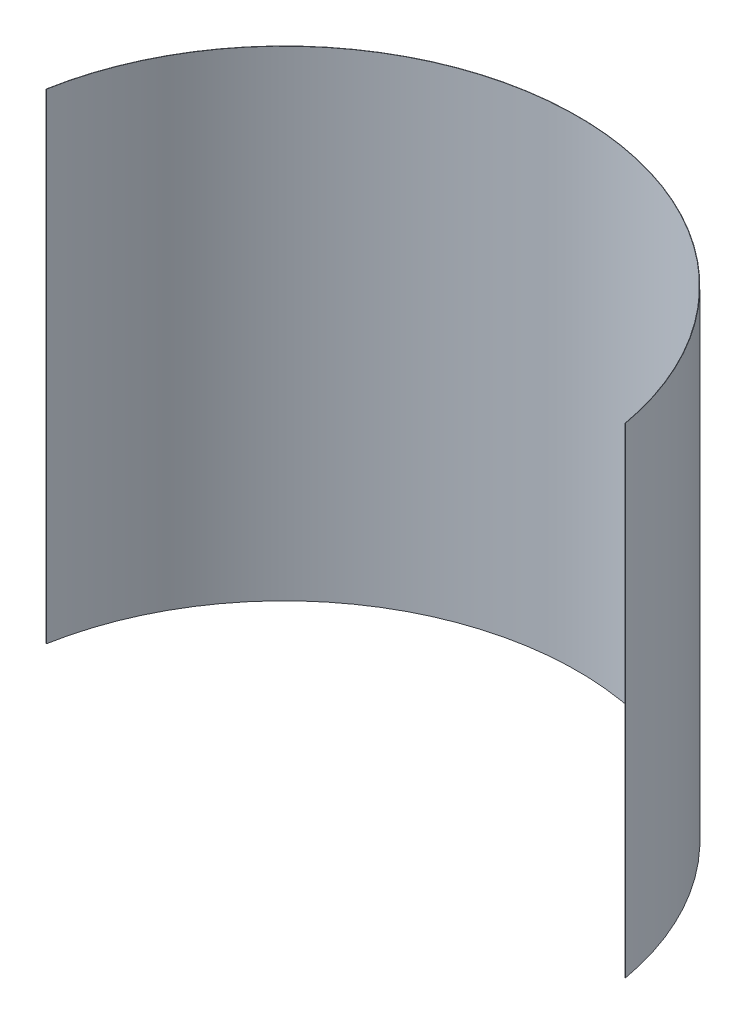
ISO-10303-21;
HEADER;
FILE_DESCRIPTION(('STEP AP214'),'2;1');
FILE_NAME('part.step','',(''),(''),'','','');
FILE_SCHEMA(('AUTOMOTIVE_DESIGN { 1 0 10303 214 1 1 1 1 }'));
ENDSEC;
DATA;
#1=APPLICATION_CONTEXT('core data for automotive mechanical design processes');
#2=APPLICATION_PROTOCOL_DEFINITION('international standard','automotive_design',2000,#1);
#3=PRODUCT_CONTEXT('',#1,'mechanical');
#4=PRODUCT('Part','Part','',(#3));
#5=PRODUCT_RELATED_PRODUCT_CATEGORY('part','',(#4));
#6=PRODUCT_DEFINITION_FORMATION('','',#4);
#7=PRODUCT_DEFINITION_CONTEXT('part definition',#1,'design');
#8=PRODUCT_DEFINITION('design','',#6,#7);
#9=PRODUCT_DEFINITION_SHAPE('','',#8);
#10=(LENGTH_UNIT() NAMED_UNIT(*) SI_UNIT(.MILLI.,.METRE.));
#11=(NAMED_UNIT(*) PLANE_ANGLE_UNIT() SI_UNIT($,.RADIAN.));
#12=(NAMED_UNIT(*) SI_UNIT($,.STERADIAN.) SOLID_ANGLE_UNIT());
#13=UNCERTAINTY_MEASURE_WITH_UNIT(LENGTH_MEASURE(1.E-05),#10,'distance_accuracy_value','');
#14=(GEOMETRIC_REPRESENTATION_CONTEXT(3) GLOBAL_UNCERTAINTY_ASSIGNED_CONTEXT((#13)) GLOBAL_UNIT_ASSIGNED_CONTEXT((#10,
#11,#12)) REPRESENTATION_CONTEXT('',''));
#15=CARTESIAN_POINT('',(0.,0.,0.));
#16=DIRECTION('',(0.,0.,1.));
#17=DIRECTION('',(1.,0.,0.));
#18=AXIS2_PLACEMENT_3D('',#15,#16,#17);
#19=CARTESIAN_POINT('',(1067.6,0.,0.));
#20=DIRECTION('',(0.,1.,0.));
#21=DIRECTION('',(0.,0.,1.));
#22=AXIS2_PLACEMENT_3D('',#19,#20,#21);
#23=PLANE('',#22);
#24=DIRECTION('',(-0.984272308752148,0.,-0.176657924316223));
#25=VECTOR('',#24,1.);
#26=CARTESIAN_POINT('',(16.7908831762067,0.,-188.6));
#27=LINE('',#26,#25);
#28=CARTESIAN_POINT('',(17.7751554849588,0.,-188.423342075684));
#29=VERTEX_POINT('',#28);
#30=CARTESIAN_POINT('',(16.7908831762067,0.,-188.6));
#31=VERTEX_POINT('',#30);
#32=EDGE_CURVE('E11',#29,#31,#27,.T.);
#33=ORIENTED_EDGE('',*,*,#32,.F.);
#34=CARTESIAN_POINT('',(1067.6,0.,0.));
#35=DIRECTION('',(0.,-1.,0.));
#36=DIRECTION('',(0.,0.,-1.));
#37=AXIS2_PLACEMENT_3D('',#34,#35,#36);
#38=CIRCLE('',#37,1066.6);
#39=CARTESIAN_POINT('',(2117.42484451504,0.,-188.423342075684));
#40=VERTEX_POINT('',#39);
#41=EDGE_CURVE('E76',#29,#40,#38,.T.);
#42=ORIENTED_EDGE('',*,*,#41,.T.);
#43=DIRECTION('',(0.984272308752148,0.,-0.176657924316223));
#44=VECTOR('',#43,1.);
#45=CARTESIAN_POINT('',(2118.40911682379,0.,-188.6));
#46=LINE('',#45,#44);
#47=CARTESIAN_POINT('',(2118.40911682379,0.,-188.6));
#48=VERTEX_POINT('',#47);
#49=EDGE_CURVE('E52',#40,#48,#46,.T.);
#50=ORIENTED_EDGE('',*,*,#49,.T.);
#51=CARTESIAN_POINT('',(1067.6,0.,0.));
#52=DIRECTION('',(0.,-1.,0.));
#53=DIRECTION('',(0.,0.,-1.));
#54=AXIS2_PLACEMENT_3D('',#51,#52,#53);
#55=CIRCLE('',#54,1067.6);
#56=EDGE_CURVE('E78',#31,#48,#55,.T.);
#57=ORIENTED_EDGE('',*,*,#56,.F.);
#58=EDGE_LOOP('',(#33,#42,#50,#57));
#59=FACE_BOUND('',#58,.T.);
#60=ADVANCED_FACE('F41',(#59),#23,.T.);
#61=CARTESIAN_POINT('',(2118.40911682379,-871.5,-188.6));
#62=DIRECTION('',(0.176657924316223,0.,0.984272308752148));
#63=DIRECTION('',(0.,-1.,0.));
#64=AXIS2_PLACEMENT_3D('',#61,#62,#63);
#65=PLANE('',#64);
#66=ORIENTED_EDGE('',*,*,#49,.F.);
#67=DIRECTION('',(0.,-1.,0.));
#68=VECTOR('',#67,1.);
#69=CARTESIAN_POINT('',(2117.42484451504,0.,-188.423342075684));
#70=LINE('',#69,#68);
#71=CARTESIAN_POINT('',(2117.42484451504,-1743.,-188.423342075684));
#72=VERTEX_POINT('',#71);
#73=EDGE_CURVE('E90',#40,#72,#70,.T.);
#74=ORIENTED_EDGE('',*,*,#73,.T.);
#75=DIRECTION('',(0.984272308752148,0.,-0.176657924316223));
#76=VECTOR('',#75,1.);
#77=CARTESIAN_POINT('',(2118.40911682379,-1743.,-188.6));
#78=LINE('',#77,#76);
#79=CARTESIAN_POINT('',(2118.40911682379,-1743.,-188.6));
#80=VERTEX_POINT('',#79);
#81=EDGE_CURVE('E101',#72,#80,#78,.T.);
#82=ORIENTED_EDGE('',*,*,#81,.T.);
#83=DIRECTION('',(0.,-1.,0.));
#84=VECTOR('',#83,1.);
#85=CARTESIAN_POINT('',(2118.40911682379,0.,-188.6));
#86=LINE('',#85,#84);
#87=EDGE_CURVE('E107',#48,#80,#86,.T.);
#88=ORIENTED_EDGE('',*,*,#87,.F.);
#89=EDGE_LOOP('',(#66,#74,#82,#88));
#90=FACE_BOUND('',#89,.T.);
#91=ADVANCED_FACE('F121',(#90),#65,.T.);
#92=CARTESIAN_POINT('',(1067.6,-1743.,0.));
#93=DIRECTION('',(0.,1.,0.));
#94=DIRECTION('',(0.,0.,1.));
#95=AXIS2_PLACEMENT_3D('',#92,#93,#94);
#96=PLANE('',#95);
#97=ORIENTED_EDGE('',*,*,#81,.F.);
#98=CARTESIAN_POINT('',(1067.6,-1743.,0.));
#99=DIRECTION('',(0.,-1.,0.));
#100=DIRECTION('',(0.,0.,-1.));
#101=AXIS2_PLACEMENT_3D('',#98,#99,#100);
#102=CIRCLE('',#101,1066.6);
#103=CARTESIAN_POINT('',(17.7751554849588,-1743.,-188.423342075684));
#104=VERTEX_POINT('',#103);
#105=EDGE_CURVE('E95',#104,#72,#102,.T.);
#106=ORIENTED_EDGE('',*,*,#105,.F.);
#107=DIRECTION('',(-0.984272308752148,0.,-0.176657924316223));
#108=VECTOR('',#107,1.);
#109=CARTESIAN_POINT('',(16.7908831762067,-1743.,-188.6));
#110=LINE('',#109,#108);
#111=CARTESIAN_POINT('',(16.7908831762067,-1743.,-188.6));
#112=VERTEX_POINT('',#111);
#113=EDGE_CURVE('E45',#104,#112,#110,.T.);
#114=ORIENTED_EDGE('',*,*,#113,.T.);
#115=CARTESIAN_POINT('',(1067.6,-1743.,0.));
#116=DIRECTION('',(0.,-1.,0.));
#117=DIRECTION('',(0.,0.,-1.));
#118=AXIS2_PLACEMENT_3D('',#115,#116,#117);
#119=CIRCLE('',#118,1067.6);
#120=EDGE_CURVE('E115',#112,#80,#119,.T.);
#121=ORIENTED_EDGE('',*,*,#120,.T.);
#122=EDGE_LOOP('',(#97,#106,#114,#121));
#123=FACE_BOUND('',#122,.T.);
#124=ADVANCED_FACE('F127',(#123),#96,.F.);
#125=CARTESIAN_POINT('',(16.7908831762067,-871.5,-188.6));
#126=DIRECTION('',(0.176657924316223,0.,-0.984272308752148));
#127=DIRECTION('',(0.,-1.,0.));
#128=AXIS2_PLACEMENT_3D('',#125,#126,#127);
#129=PLANE('',#128);
#130=DIRECTION('',(0.,-1.,0.));
#131=VECTOR('',#130,1.);
#132=CARTESIAN_POINT('',(17.7751554849588,0.,-188.423342075684));
#133=LINE('',#132,#131);
#134=EDGE_CURVE('E87',#29,#104,#133,.T.);
#135=ORIENTED_EDGE('',*,*,#134,.F.);
#136=ORIENTED_EDGE('',*,*,#32,.T.);
#137=DIRECTION('',(0.,-1.,0.));
#138=VECTOR('',#137,1.);
#139=CARTESIAN_POINT('',(16.7908831762067,0.,-188.6));
#140=LINE('',#139,#138);
#141=EDGE_CURVE('E112',#31,#112,#140,.T.);
#142=ORIENTED_EDGE('',*,*,#141,.T.);
#143=ORIENTED_EDGE('',*,*,#113,.F.);
#144=EDGE_LOOP('',(#135,#136,#142,#143));
#145=FACE_BOUND('',#144,.T.);
#146=ADVANCED_FACE('F43',(#145),#129,.F.);
#147=CARTESIAN_POINT('',(1067.6,0.,0.));
#148=DIRECTION('',(0.,-1.,0.));
#149=DIRECTION('',(0.,0.,-1.));
#150=AXIS2_PLACEMENT_3D('',#147,#148,#149);
#151=CYLINDRICAL_SURFACE('',#150,1067.6);
#152=ORIENTED_EDGE('',*,*,#120,.F.);
#153=ORIENTED_EDGE('',*,*,#141,.F.);
#154=ORIENTED_EDGE('',*,*,#56,.T.);
#155=ORIENTED_EDGE('',*,*,#87,.T.);
#156=EDGE_LOOP('',(#152,#153,#154,#155));
#157=FACE_BOUND('',#156,.T.);
#158=ADVANCED_FACE('F125',(#157),#151,.T.);
#159=CARTESIAN_POINT('',(1067.6,0.,0.));
#160=DIRECTION('',(0.,-1.,0.));
#161=DIRECTION('',(0.,0.,-1.));
#162=AXIS2_PLACEMENT_3D('',#159,#160,#161);
#163=CYLINDRICAL_SURFACE('',#162,1066.6);
#164=ORIENTED_EDGE('',*,*,#105,.T.);
#165=ORIENTED_EDGE('',*,*,#73,.F.);
#166=ORIENTED_EDGE('',*,*,#41,.F.);
#167=ORIENTED_EDGE('',*,*,#134,.T.);
#168=EDGE_LOOP('',(#164,#165,#166,#167));
#169=FACE_BOUND('',#168,.T.);
#170=ADVANCED_FACE('F86',(#169),#163,.F.);
#171=CLOSED_SHELL('',(#60,#91,#124,#146,#158,#170));
#172=MANIFOLD_SOLID_BREP('B2',#171);
#173=ADVANCED_BREP_SHAPE_REPRESENTATION('',(#18,#172),#14);
#174=SHAPE_DEFINITION_REPRESENTATION(#9,#173);
ENDSEC;
END-ISO-10303-21;
